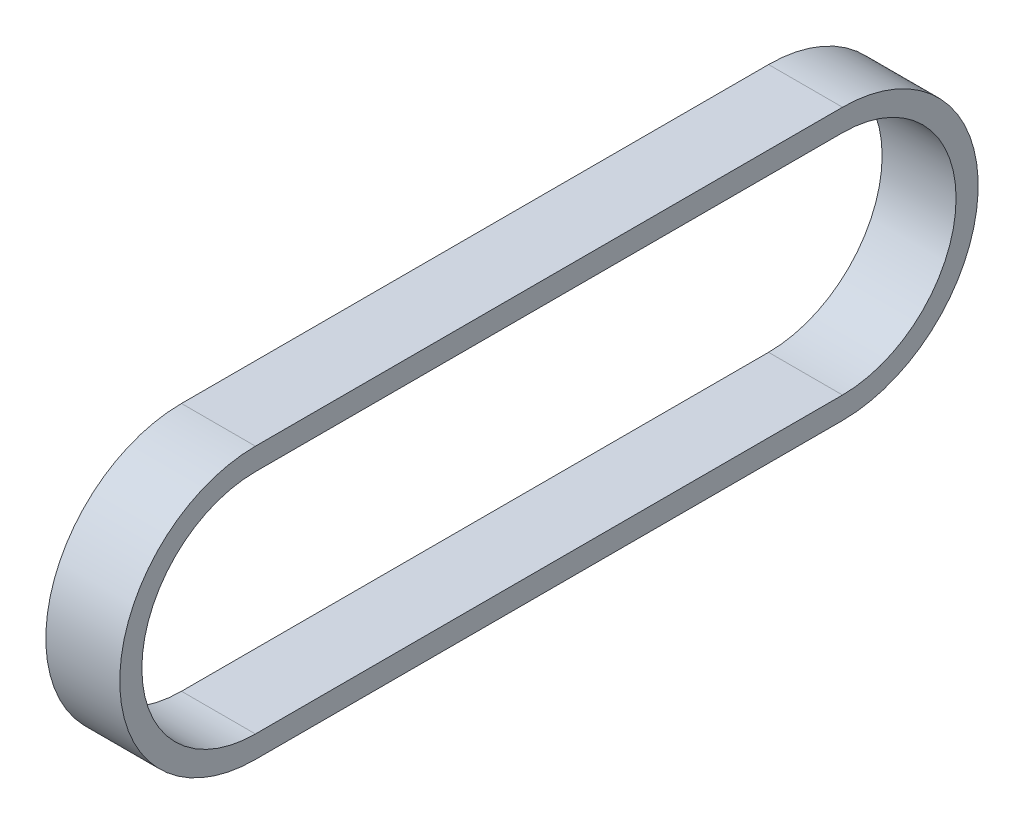
ISO-10303-21;
HEADER;
FILE_DESCRIPTION(('STEP AP214'),'2;1');
FILE_NAME('part.step','',(''),(''),'','','');
FILE_SCHEMA(('AUTOMOTIVE_DESIGN { 1 0 10303 214 1 1 1 1 }'));
ENDSEC;
DATA;
#1=APPLICATION_CONTEXT('core data for automotive mechanical design processes');
#2=APPLICATION_PROTOCOL_DEFINITION('international standard','automotive_design',2000,#1);
#3=PRODUCT_CONTEXT('',#1,'mechanical');
#4=PRODUCT('Part','Part','',(#3));
#5=PRODUCT_RELATED_PRODUCT_CATEGORY('part','',(#4));
#6=PRODUCT_DEFINITION_FORMATION('','',#4);
#7=PRODUCT_DEFINITION_CONTEXT('part definition',#1,'design');
#8=PRODUCT_DEFINITION('design','',#6,#7);
#9=PRODUCT_DEFINITION_SHAPE('','',#8);
#10=(LENGTH_UNIT() NAMED_UNIT(*) SI_UNIT(.MILLI.,.METRE.));
#11=(NAMED_UNIT(*) PLANE_ANGLE_UNIT() SI_UNIT($,.RADIAN.));
#12=(NAMED_UNIT(*) SI_UNIT($,.STERADIAN.) SOLID_ANGLE_UNIT());
#13=UNCERTAINTY_MEASURE_WITH_UNIT(LENGTH_MEASURE(1.E-05),#10,'distance_accuracy_value','');
#14=(GEOMETRIC_REPRESENTATION_CONTEXT(3) GLOBAL_UNCERTAINTY_ASSIGNED_CONTEXT((#13)) GLOBAL_UNIT_ASSIGNED_CONTEXT((#10,
#11,#12)) REPRESENTATION_CONTEXT('',''));
#15=CARTESIAN_POINT('',(0.,0.,0.));
#16=DIRECTION('',(0.,0.,1.));
#17=DIRECTION('',(1.,0.,0.));
#18=AXIS2_PLACEMENT_3D('',#15,#16,#17);
#19=CARTESIAN_POINT('',(8.5,0.,33.7439));
#20=DIRECTION('',(1.,0.,0.));
#21=DIRECTION('',(0.,0.,-1.));
#22=AXIS2_PLACEMENT_3D('',#19,#20,#21);
#23=PLANE('',#22);
#24=CARTESIAN_POINT('',(8.5,0.,33.7439));
#25=DIRECTION('',(1.,0.,0.));
#26=DIRECTION('',(0.,0.,-1.));
#27=AXIS2_PLACEMENT_3D('',#24,#25,#26);
#28=CIRCLE('',#27,15.5956);
#29=CARTESIAN_POINT('',(8.5,15.5956,33.7439));
#30=VERTEX_POINT('',#29);
#31=CARTESIAN_POINT('',(8.5,-15.5956,33.7439));
#32=VERTEX_POINT('',#31);
#33=EDGE_CURVE('E164',#30,#32,#28,.T.);
#34=ORIENTED_EDGE('',*,*,#33,.T.);
#35=DIRECTION('',(0.,0.,-1.));
#36=VECTOR('',#35,1.);
#37=CARTESIAN_POINT('',(8.5,-15.5956,33.7439));
#38=LINE('',#37,#36);
#39=CARTESIAN_POINT('',(8.5,-15.5956,-33.7439));
#40=VERTEX_POINT('',#39);
#41=EDGE_CURVE('E167',#32,#40,#38,.T.);
#42=ORIENTED_EDGE('',*,*,#41,.T.);
#43=CARTESIAN_POINT('',(8.5,0.,-33.7439));
#44=DIRECTION('',(1.,0.,0.));
#45=DIRECTION('',(0.,0.,-1.));
#46=AXIS2_PLACEMENT_3D('',#43,#44,#45);
#47=CIRCLE('',#46,15.5956);
#48=CARTESIAN_POINT('',(8.5,15.5956,-33.7439));
#49=VERTEX_POINT('',#48);
#50=EDGE_CURVE('E170',#40,#49,#47,.T.);
#51=ORIENTED_EDGE('',*,*,#50,.T.);
#52=DIRECTION('',(0.,0.,1.));
#53=VECTOR('',#52,1.);
#54=CARTESIAN_POINT('',(8.5,15.5956,33.7439));
#55=LINE('',#54,#53);
#56=EDGE_CURVE('E172',#49,#30,#55,.T.);
#57=ORIENTED_EDGE('',*,*,#56,.T.);
#58=EDGE_LOOP('',(#34,#42,#51,#57));
#59=FACE_BOUND('',#58,.T.);
#60=DIRECTION('',(0.,0.,-1.));
#61=VECTOR('',#60,1.);
#62=CARTESIAN_POINT('',(8.5,-13.0556,33.7439));
#63=LINE('',#62,#61);
#64=CARTESIAN_POINT('',(8.5,-13.0556,33.7439));
#65=VERTEX_POINT('',#64);
#66=CARTESIAN_POINT('',(8.5,-13.0556,-33.7439));
#67=VERTEX_POINT('',#66);
#68=EDGE_CURVE('E136',#65,#67,#63,.T.);
#69=ORIENTED_EDGE('',*,*,#68,.F.);
#70=CARTESIAN_POINT('',(8.5,0.,33.7439));
#71=DIRECTION('',(1.,0.,0.));
#72=DIRECTION('',(0.,0.,-1.));
#73=AXIS2_PLACEMENT_3D('',#70,#71,#72);
#74=CIRCLE('',#73,13.0556);
#75=CARTESIAN_POINT('',(8.5,13.0556,33.7439));
#76=VERTEX_POINT('',#75);
#77=EDGE_CURVE('E128',#76,#65,#74,.T.);
#78=ORIENTED_EDGE('',*,*,#77,.F.);
#79=DIRECTION('',(0.,0.,1.));
#80=VECTOR('',#79,1.);
#81=CARTESIAN_POINT('',(8.5,13.0556,33.7439));
#82=LINE('',#81,#80);
#83=CARTESIAN_POINT('',(8.5,13.0556,-33.7439));
#84=VERTEX_POINT('',#83);
#85=EDGE_CURVE('E150',#84,#76,#82,.T.);
#86=ORIENTED_EDGE('',*,*,#85,.F.);
#87=CARTESIAN_POINT('',(8.5,0.,-33.7439));
#88=DIRECTION('',(1.,0.,0.));
#89=DIRECTION('',(0.,0.,-1.));
#90=AXIS2_PLACEMENT_3D('',#87,#88,#89);
#91=CIRCLE('',#90,13.0556);
#92=EDGE_CURVE('E148',#67,#84,#91,.T.);
#93=ORIENTED_EDGE('',*,*,#92,.F.);
#94=EDGE_LOOP('',(#69,#78,#86,#93));
#95=FACE_BOUND('',#94,.T.);
#96=ADVANCED_FACE('F63',(#59,#95),#23,.T.);
#97=CARTESIAN_POINT('',(0.,0.,33.7439));
#98=DIRECTION('',(1.,0.,0.));
#99=DIRECTION('',(0.,0.,-1.));
#100=AXIS2_PLACEMENT_3D('',#97,#98,#99);
#101=PLANE('',#100);
#102=CARTESIAN_POINT('',(0.,0.,33.7439));
#103=DIRECTION('',(1.,0.,0.));
#104=DIRECTION('',(0.,0.,-1.));
#105=AXIS2_PLACEMENT_3D('',#102,#103,#104);
#106=CIRCLE('',#105,15.5956);
#107=CARTESIAN_POINT('',(0.,15.5956,33.7439));
#108=VERTEX_POINT('',#107);
#109=CARTESIAN_POINT('',(0.,-15.5956,33.7439));
#110=VERTEX_POINT('',#109);
#111=EDGE_CURVE('E144',#108,#110,#106,.T.);
#112=ORIENTED_EDGE('',*,*,#111,.F.);
#113=DIRECTION('',(0.,0.,1.));
#114=VECTOR('',#113,1.);
#115=CARTESIAN_POINT('',(0.,15.5956,33.7439));
#116=LINE('',#115,#114);
#117=CARTESIAN_POINT('',(0.,15.5956,-33.7439));
#118=VERTEX_POINT('',#117);
#119=EDGE_CURVE('E168',#118,#108,#116,.T.);
#120=ORIENTED_EDGE('',*,*,#119,.F.);
#121=CARTESIAN_POINT('',(0.,0.,-33.7439));
#122=DIRECTION('',(1.,0.,0.));
#123=DIRECTION('',(0.,0.,-1.));
#124=AXIS2_PLACEMENT_3D('',#121,#122,#123);
#125=CIRCLE('',#124,15.5956);
#126=CARTESIAN_POINT('',(0.,-15.5956,-33.7439));
#127=VERTEX_POINT('',#126);
#128=EDGE_CURVE('E179',#127,#118,#125,.T.);
#129=ORIENTED_EDGE('',*,*,#128,.F.);
#130=DIRECTION('',(0.,0.,-1.));
#131=VECTOR('',#130,1.);
#132=CARTESIAN_POINT('',(0.,-15.5956,33.7439));
#133=LINE('',#132,#131);
#134=EDGE_CURVE('E177',#110,#127,#133,.T.);
#135=ORIENTED_EDGE('',*,*,#134,.F.);
#136=EDGE_LOOP('',(#112,#120,#129,#135));
#137=FACE_BOUND('',#136,.T.);
#138=CARTESIAN_POINT('',(0.,0.,33.7439));
#139=DIRECTION('',(1.,0.,0.));
#140=DIRECTION('',(0.,0.,-1.));
#141=AXIS2_PLACEMENT_3D('',#138,#139,#140);
#142=CIRCLE('',#141,13.0556);
#143=CARTESIAN_POINT('',(0.,13.0556,33.7439));
#144=VERTEX_POINT('',#143);
#145=CARTESIAN_POINT('',(0.,-13.0556,33.7439));
#146=VERTEX_POINT('',#145);
#147=EDGE_CURVE('E86',#144,#146,#142,.T.);
#148=ORIENTED_EDGE('',*,*,#147,.T.);
#149=DIRECTION('',(0.,0.,-1.));
#150=VECTOR('',#149,1.);
#151=CARTESIAN_POINT('',(0.,-13.0556,33.7439));
#152=LINE('',#151,#150);
#153=CARTESIAN_POINT('',(0.,-13.0556,-33.7439));
#154=VERTEX_POINT('',#153);
#155=EDGE_CURVE('E143',#146,#154,#152,.T.);
#156=ORIENTED_EDGE('',*,*,#155,.T.);
#157=CARTESIAN_POINT('',(0.,0.,-33.7439));
#158=DIRECTION('',(1.,0.,0.));
#159=DIRECTION('',(0.,0.,-1.));
#160=AXIS2_PLACEMENT_3D('',#157,#158,#159);
#161=CIRCLE('',#160,13.0556);
#162=CARTESIAN_POINT('',(0.,13.0556,-33.7439));
#163=VERTEX_POINT('',#162);
#164=EDGE_CURVE('E156',#154,#163,#161,.T.);
#165=ORIENTED_EDGE('',*,*,#164,.T.);
#166=DIRECTION('',(0.,0.,1.));
#167=VECTOR('',#166,1.);
#168=CARTESIAN_POINT('',(0.,13.0556,33.7439));
#169=LINE('',#168,#167);
#170=EDGE_CURVE('E137',#163,#144,#169,.T.);
#171=ORIENTED_EDGE('',*,*,#170,.T.);
#172=EDGE_LOOP('',(#148,#156,#165,#171));
#173=FACE_BOUND('',#172,.T.);
#174=ADVANCED_FACE('F197',(#137,#173),#101,.F.);
#175=CARTESIAN_POINT('',(8.5,0.,33.7439));
#176=DIRECTION('',(-1.,0.,0.));
#177=DIRECTION('',(0.,0.,1.));
#178=AXIS2_PLACEMENT_3D('',#175,#176,#177);
#179=CYLINDRICAL_SURFACE('',#178,15.5956);
#180=ORIENTED_EDGE('',*,*,#111,.T.);
#181=DIRECTION('',(-1.,0.,0.));
#182=VECTOR('',#181,1.);
#183=CARTESIAN_POINT('',(8.5,-15.5956,33.7439));
#184=LINE('',#183,#182);
#185=EDGE_CURVE('E12',#32,#110,#184,.T.);
#186=ORIENTED_EDGE('',*,*,#185,.F.);
#187=ORIENTED_EDGE('',*,*,#33,.F.);
#188=DIRECTION('',(-1.,0.,0.));
#189=VECTOR('',#188,1.);
#190=CARTESIAN_POINT('',(8.5,15.5956,33.7439));
#191=LINE('',#190,#189);
#192=EDGE_CURVE('E174',#30,#108,#191,.T.);
#193=ORIENTED_EDGE('',*,*,#192,.T.);
#194=EDGE_LOOP('',(#180,#186,#187,#193));
#195=FACE_BOUND('',#194,.T.);
#196=ADVANCED_FACE('F65',(#195),#179,.T.);
#197=CARTESIAN_POINT('',(8.5,-15.5956,33.7439));
#198=DIRECTION('',(0.,1.,0.));
#199=DIRECTION('',(0.,0.,1.));
#200=AXIS2_PLACEMENT_3D('',#197,#198,#199);
#201=PLANE('',#200);
#202=ORIENTED_EDGE('',*,*,#134,.T.);
#203=DIRECTION('',(-1.,0.,0.));
#204=VECTOR('',#203,1.);
#205=CARTESIAN_POINT('',(8.5,-15.5956,-33.7439));
#206=LINE('',#205,#204);
#207=EDGE_CURVE('E71',#40,#127,#206,.T.);
#208=ORIENTED_EDGE('',*,*,#207,.F.);
#209=ORIENTED_EDGE('',*,*,#41,.F.);
#210=ORIENTED_EDGE('',*,*,#185,.T.);
#211=EDGE_LOOP('',(#202,#208,#209,#210));
#212=FACE_BOUND('',#211,.T.);
#213=ADVANCED_FACE('F207',(#212),#201,.F.);
#214=CARTESIAN_POINT('',(8.5,0.,-33.7439));
#215=DIRECTION('',(-1.,0.,0.));
#216=DIRECTION('',(0.,0.,1.));
#217=AXIS2_PLACEMENT_3D('',#214,#215,#216);
#218=CYLINDRICAL_SURFACE('',#217,15.5956);
#219=ORIENTED_EDGE('',*,*,#128,.T.);
#220=DIRECTION('',(-1.,0.,0.));
#221=VECTOR('',#220,1.);
#222=CARTESIAN_POINT('',(8.5,15.5956,-33.7439));
#223=LINE('',#222,#221);
#224=EDGE_CURVE('E184',#49,#118,#223,.T.);
#225=ORIENTED_EDGE('',*,*,#224,.F.);
#226=ORIENTED_EDGE('',*,*,#50,.F.);
#227=ORIENTED_EDGE('',*,*,#207,.T.);
#228=EDGE_LOOP('',(#219,#225,#226,#227));
#229=FACE_BOUND('',#228,.T.);
#230=ADVANCED_FACE('F191',(#229),#218,.T.);
#231=CARTESIAN_POINT('',(8.5,15.5956,33.7439));
#232=DIRECTION('',(0.,-1.,0.));
#233=DIRECTION('',(0.,0.,-1.));
#234=AXIS2_PLACEMENT_3D('',#231,#232,#233);
#235=PLANE('',#234);
#236=ORIENTED_EDGE('',*,*,#119,.T.);
#237=ORIENTED_EDGE('',*,*,#192,.F.);
#238=ORIENTED_EDGE('',*,*,#56,.F.);
#239=ORIENTED_EDGE('',*,*,#224,.T.);
#240=EDGE_LOOP('',(#236,#237,#238,#239));
#241=FACE_BOUND('',#240,.T.);
#242=ADVANCED_FACE('F201',(#241),#235,.F.);
#243=CARTESIAN_POINT('',(8.5,0.,33.7439));
#244=DIRECTION('',(-1.,0.,0.));
#245=DIRECTION('',(0.,0.,1.));
#246=AXIS2_PLACEMENT_3D('',#243,#244,#245);
#247=CYLINDRICAL_SURFACE('',#246,13.0556);
#248=ORIENTED_EDGE('',*,*,#147,.F.);
#249=DIRECTION('',(-1.,0.,0.));
#250=VECTOR('',#249,1.);
#251=CARTESIAN_POINT('',(8.5,13.0556,33.7439));
#252=LINE('',#251,#250);
#253=EDGE_CURVE('E132',#76,#144,#252,.T.);
#254=ORIENTED_EDGE('',*,*,#253,.F.);
#255=ORIENTED_EDGE('',*,*,#77,.T.);
#256=DIRECTION('',(-1.,0.,0.));
#257=VECTOR('',#256,1.);
#258=CARTESIAN_POINT('',(8.5,-13.0556,33.7439));
#259=LINE('',#258,#257);
#260=EDGE_CURVE('E131',#65,#146,#259,.T.);
#261=ORIENTED_EDGE('',*,*,#260,.T.);
#262=EDGE_LOOP('',(#248,#254,#255,#261));
#263=FACE_BOUND('',#262,.T.);
#264=ADVANCED_FACE('F130',(#263),#247,.F.);
#265=CARTESIAN_POINT('',(8.5,-13.0556,33.7439));
#266=DIRECTION('',(0.,1.,0.));
#267=DIRECTION('',(0.,0.,1.));
#268=AXIS2_PLACEMENT_3D('',#265,#266,#267);
#269=PLANE('',#268);
#270=ORIENTED_EDGE('',*,*,#155,.F.);
#271=ORIENTED_EDGE('',*,*,#260,.F.);
#272=ORIENTED_EDGE('',*,*,#68,.T.);
#273=DIRECTION('',(-1.,0.,0.));
#274=VECTOR('',#273,1.);
#275=CARTESIAN_POINT('',(8.5,-13.0556,-33.7439));
#276=LINE('',#275,#274);
#277=EDGE_CURVE('E145',#67,#154,#276,.T.);
#278=ORIENTED_EDGE('',*,*,#277,.T.);
#279=EDGE_LOOP('',(#270,#271,#272,#278));
#280=FACE_BOUND('',#279,.T.);
#281=ADVANCED_FACE('F140',(#280),#269,.T.);
#282=CARTESIAN_POINT('',(8.5,0.,-33.7439));
#283=DIRECTION('',(-1.,0.,0.));
#284=DIRECTION('',(0.,0.,1.));
#285=AXIS2_PLACEMENT_3D('',#282,#283,#284);
#286=CYLINDRICAL_SURFACE('',#285,13.0556);
#287=ORIENTED_EDGE('',*,*,#164,.F.);
#288=ORIENTED_EDGE('',*,*,#277,.F.);
#289=ORIENTED_EDGE('',*,*,#92,.T.);
#290=DIRECTION('',(-1.,0.,0.));
#291=VECTOR('',#290,1.);
#292=CARTESIAN_POINT('',(8.5,13.0556,-33.7439));
#293=LINE('',#292,#291);
#294=EDGE_CURVE('E78',#84,#163,#293,.T.);
#295=ORIENTED_EDGE('',*,*,#294,.T.);
#296=EDGE_LOOP('',(#287,#288,#289,#295));
#297=FACE_BOUND('',#296,.T.);
#298=ADVANCED_FACE('F230',(#297),#286,.F.);
#299=CARTESIAN_POINT('',(8.5,13.0556,33.7439));
#300=DIRECTION('',(0.,-1.,0.));
#301=DIRECTION('',(0.,0.,-1.));
#302=AXIS2_PLACEMENT_3D('',#299,#300,#301);
#303=PLANE('',#302);
#304=ORIENTED_EDGE('',*,*,#170,.F.);
#305=ORIENTED_EDGE('',*,*,#294,.F.);
#306=ORIENTED_EDGE('',*,*,#85,.T.);
#307=ORIENTED_EDGE('',*,*,#253,.T.);
#308=EDGE_LOOP('',(#304,#305,#306,#307));
#309=FACE_BOUND('',#308,.T.);
#310=ADVANCED_FACE('F234',(#309),#303,.T.);
#311=CLOSED_SHELL('',(#96,#174,#196,#213,#230,#242,#264,#281,#298,#310));
#312=MANIFOLD_SOLID_BREP('B2',#311);
#313=ADVANCED_BREP_SHAPE_REPRESENTATION('',(#18,#312),#14);
#314=SHAPE_DEFINITION_REPRESENTATION(#9,#313);
ENDSEC;
END-ISO-10303-21;
